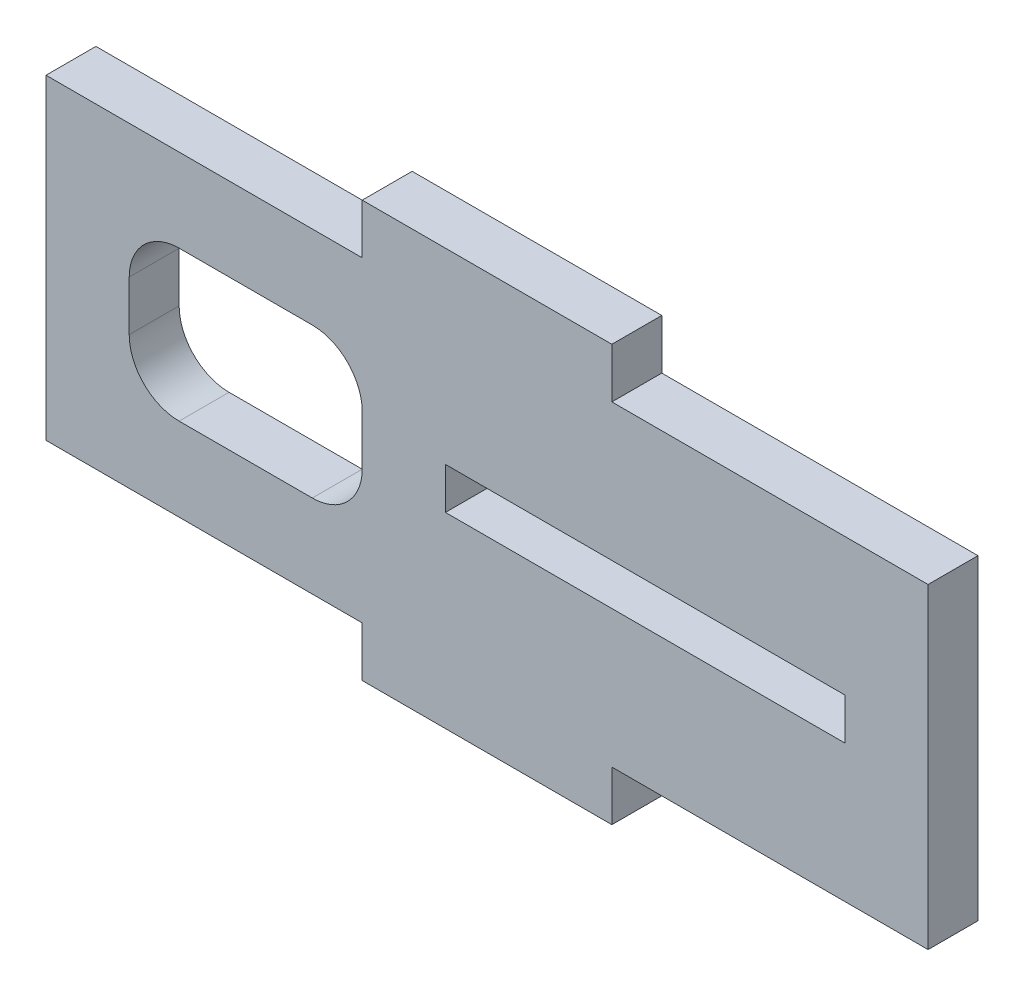
ISO-10303-21;
HEADER;
FILE_DESCRIPTION(('STEP AP214'),'2;1');
FILE_NAME('part.step','',(''),(''),'','','');
FILE_SCHEMA(('AUTOMOTIVE_DESIGN { 1 0 10303 214 1 1 1 1 }'));
ENDSEC;
DATA;
#1=APPLICATION_CONTEXT('core data for automotive mechanical design processes');
#2=APPLICATION_PROTOCOL_DEFINITION('international standard','automotive_design',2000,#1);
#3=PRODUCT_CONTEXT('',#1,'mechanical');
#4=PRODUCT('Part','Part','',(#3));
#5=PRODUCT_RELATED_PRODUCT_CATEGORY('part','',(#4));
#6=PRODUCT_DEFINITION_FORMATION('','',#4);
#7=PRODUCT_DEFINITION_CONTEXT('part definition',#1,'design');
#8=PRODUCT_DEFINITION('design','',#6,#7);
#9=PRODUCT_DEFINITION_SHAPE('','',#8);
#10=(LENGTH_UNIT() NAMED_UNIT(*) SI_UNIT(.MILLI.,.METRE.));
#11=(NAMED_UNIT(*) PLANE_ANGLE_UNIT() SI_UNIT($,.RADIAN.));
#12=(NAMED_UNIT(*) SI_UNIT($,.STERADIAN.) SOLID_ANGLE_UNIT());
#13=UNCERTAINTY_MEASURE_WITH_UNIT(LENGTH_MEASURE(1.E-05),#10,'distance_accuracy_value','');
#14=(GEOMETRIC_REPRESENTATION_CONTEXT(3) GLOBAL_UNCERTAINTY_ASSIGNED_CONTEXT((#13)) GLOBAL_UNIT_ASSIGNED_CONTEXT((#10,
#11,#12)) REPRESENTATION_CONTEXT('',''));
#15=CARTESIAN_POINT('',(0.,0.,0.));
#16=DIRECTION('',(0.,0.,1.));
#17=DIRECTION('',(1.,0.,0.));
#18=AXIS2_PLACEMENT_3D('',#15,#16,#17);
#19=CARTESIAN_POINT('',(0.,0.,2.99999999999989));
#20=DIRECTION('',(0.,0.,-1.));
#21=DIRECTION('',(-1.,0.,0.));
#22=AXIS2_PLACEMENT_3D('',#19,#20,#21);
#23=PLANE('',#22);
#24=DIRECTION('',(0.,-1.,0.));
#25=VECTOR('',#24,1.);
#26=CARTESIAN_POINT('',(-2.5,1.25,3.00000000000011));
#27=LINE('',#26,#25);
#28=CARTESIAN_POINT('',(-2.5,1.25,3.00000000000011));
#29=VERTEX_POINT('',#28);
#30=CARTESIAN_POINT('',(-2.5,-1.25,3.00000000000011));
#31=VERTEX_POINT('',#30);
#32=EDGE_CURVE('E256',#29,#31,#27,.T.);
#33=ORIENTED_EDGE('',*,*,#32,.F.);
#34=DIRECTION('',(-1.,0.,0.));
#35=VECTOR('',#34,1.);
#36=CARTESIAN_POINT('',(-2.5,1.25,3.00000000000011));
#37=LINE('',#36,#35);
#38=CARTESIAN_POINT('',(21.5000000000001,1.25,3.00000000000011));
#39=VERTEX_POINT('',#38);
#40=EDGE_CURVE('E264',#39,#29,#37,.T.);
#41=ORIENTED_EDGE('',*,*,#40,.F.);
#42=DIRECTION('',(0.,1.,0.));
#43=VECTOR('',#42,1.);
#44=CARTESIAN_POINT('',(21.5000000000001,1.25,3.00000000000011));
#45=LINE('',#44,#43);
#46=CARTESIAN_POINT('',(21.5000000000001,-1.25,3.00000000000011));
#47=VERTEX_POINT('',#46);
#48=EDGE_CURVE('E261',#47,#39,#45,.T.);
#49=ORIENTED_EDGE('',*,*,#48,.F.);
#50=DIRECTION('',(1.,0.,0.));
#51=VECTOR('',#50,1.);
#52=CARTESIAN_POINT('',(-2.5,-1.25,3.00000000000011));
#53=LINE('',#52,#51);
#54=EDGE_CURVE('E258',#31,#47,#53,.T.);
#55=ORIENTED_EDGE('',*,*,#54,.F.);
#56=EDGE_LOOP('',(#33,#41,#49,#55));
#57=FACE_BOUND('',#56,.T.);
#58=DIRECTION('',(1.,0.,0.));
#59=VECTOR('',#58,1.);
#60=CARTESIAN_POINT('',(-7.50000000000002,-9.49999999999999,2.99999999999989));
#61=LINE('',#60,#59);
#62=CARTESIAN_POINT('',(-26.5000000000001,-9.49999999999999,2.99999999999989));
#63=VERTEX_POINT('',#62);
#64=CARTESIAN_POINT('',(-7.50000000000002,-9.49999999999999,2.99999999999989));
#65=VERTEX_POINT('',#64);
#66=EDGE_CURVE('E287',#63,#65,#61,.T.);
#67=ORIENTED_EDGE('',*,*,#66,.T.);
#68=DIRECTION('',(0.,-1.,0.));
#69=VECTOR('',#68,1.);
#70=CARTESIAN_POINT('',(-7.50000000000002,-12.5,2.99999999999989));
#71=LINE('',#70,#69);
#72=CARTESIAN_POINT('',(-7.50000000000002,-12.5,2.99999999999989));
#73=VERTEX_POINT('',#72);
#74=EDGE_CURVE('E290',#65,#73,#71,.T.);
#75=ORIENTED_EDGE('',*,*,#74,.T.);
#76=DIRECTION('',(1.,0.,0.));
#77=VECTOR('',#76,1.);
#78=CARTESIAN_POINT('',(7.50000000000002,-12.5,2.99999999999989));
#79=LINE('',#78,#77);
#80=CARTESIAN_POINT('',(7.50000000000002,-12.5,2.99999999999989));
#81=VERTEX_POINT('',#80);
#82=EDGE_CURVE('E293',#73,#81,#79,.T.);
#83=ORIENTED_EDGE('',*,*,#82,.T.);
#84=DIRECTION('',(0.,1.,0.));
#85=VECTOR('',#84,1.);
#86=CARTESIAN_POINT('',(7.50000000000002,-9.49999999999999,2.99999999999989));
#87=LINE('',#86,#85);
#88=CARTESIAN_POINT('',(7.50000000000002,-9.49999999999999,2.99999999999989));
#89=VERTEX_POINT('',#88);
#90=EDGE_CURVE('E295',#81,#89,#87,.T.);
#91=ORIENTED_EDGE('',*,*,#90,.T.);
#92=DIRECTION('',(1.,0.,0.));
#93=VECTOR('',#92,1.);
#94=CARTESIAN_POINT('',(26.5000000000001,-9.49999999999998,3.00000000000011));
#95=LINE('',#94,#93);
#96=CARTESIAN_POINT('',(26.5000000000001,-9.49999999999998,3.00000000000011));
#97=VERTEX_POINT('',#96);
#98=EDGE_CURVE('E297',#89,#97,#95,.T.);
#99=ORIENTED_EDGE('',*,*,#98,.T.);
#100=DIRECTION('',(0.,1.,0.));
#101=VECTOR('',#100,1.);
#102=CARTESIAN_POINT('',(26.5000000000001,9.50000000000002,3.00000000000011));
#103=LINE('',#102,#101);
#104=CARTESIAN_POINT('',(26.5000000000001,9.50000000000002,3.00000000000011));
#105=VERTEX_POINT('',#104);
#106=EDGE_CURVE('E299',#97,#105,#103,.T.);
#107=ORIENTED_EDGE('',*,*,#106,.T.);
#108=DIRECTION('',(-1.,0.,0.));
#109=VECTOR('',#108,1.);
#110=CARTESIAN_POINT('',(7.50000000000002,9.50000000000001,2.99999999999989));
#111=LINE('',#110,#109);
#112=CARTESIAN_POINT('',(7.50000000000002,9.50000000000001,2.99999999999989));
#113=VERTEX_POINT('',#112);
#114=EDGE_CURVE('E301',#105,#113,#111,.T.);
#115=ORIENTED_EDGE('',*,*,#114,.T.);
#116=DIRECTION('',(0.,1.,0.));
#117=VECTOR('',#116,1.);
#118=CARTESIAN_POINT('',(7.50000000000002,12.5,2.99999999999989));
#119=LINE('',#118,#117);
#120=CARTESIAN_POINT('',(7.50000000000002,12.5,2.99999999999989));
#121=VERTEX_POINT('',#120);
#122=EDGE_CURVE('E303',#113,#121,#119,.T.);
#123=ORIENTED_EDGE('',*,*,#122,.T.);
#124=DIRECTION('',(-1.,0.,0.));
#125=VECTOR('',#124,1.);
#126=CARTESIAN_POINT('',(-7.50000000000002,12.5,2.99999999999989));
#127=LINE('',#126,#125);
#128=CARTESIAN_POINT('',(-7.50000000000002,12.5,2.99999999999989));
#129=VERTEX_POINT('',#128);
#130=EDGE_CURVE('E305',#121,#129,#127,.T.);
#131=ORIENTED_EDGE('',*,*,#130,.T.);
#132=DIRECTION('',(0.,-1.,0.));
#133=VECTOR('',#132,1.);
#134=CARTESIAN_POINT('',(-7.50000000000002,9.50000000000001,2.99999999999989));
#135=LINE('',#134,#133);
#136=CARTESIAN_POINT('',(-7.50000000000002,9.50000000000001,2.99999999999989));
#137=VERTEX_POINT('',#136);
#138=EDGE_CURVE('E307',#129,#137,#135,.T.);
#139=ORIENTED_EDGE('',*,*,#138,.T.);
#140=DIRECTION('',(-1.,0.,0.));
#141=VECTOR('',#140,1.);
#142=CARTESIAN_POINT('',(-26.5000000000001,9.50000000000001,2.99999999999989));
#143=LINE('',#142,#141);
#144=CARTESIAN_POINT('',(-26.5000000000001,9.50000000000001,2.99999999999989));
#145=VERTEX_POINT('',#144);
#146=EDGE_CURVE('E309',#137,#145,#143,.T.);
#147=ORIENTED_EDGE('',*,*,#146,.T.);
#148=DIRECTION('',(0.,-1.,0.));
#149=VECTOR('',#148,1.);
#150=CARTESIAN_POINT('',(-26.5000000000001,-9.49999999999999,2.99999999999989));
#151=LINE('',#150,#149);
#152=EDGE_CURVE('E311',#145,#63,#151,.T.);
#153=ORIENTED_EDGE('',*,*,#152,.T.);
#154=EDGE_LOOP('',(#67,#75,#83,#91,#99,#107,#115,#123,#131,#139,#147,#153));
#155=FACE_BOUND('',#154,.T.);
#156=CARTESIAN_POINT('',(-10.5,1.5,2.99999999999989));
#157=DIRECTION('',(0.,0.,1.));
#158=DIRECTION('',(-1.,0.,0.));
#159=AXIS2_PLACEMENT_3D('',#156,#157,#158);
#160=CIRCLE('',#159,3.);
#161=CARTESIAN_POINT('',(-7.50000000000002,1.5,2.99999999999989));
#162=VERTEX_POINT('',#161);
#163=CARTESIAN_POINT('',(-10.5,4.5,2.99999999999989));
#164=VERTEX_POINT('',#163);
#165=EDGE_CURVE('E191',#162,#164,#160,.T.);
#166=ORIENTED_EDGE('',*,*,#165,.F.);
#167=DIRECTION('',(0.,1.,0.));
#168=VECTOR('',#167,1.);
#169=CARTESIAN_POINT('',(-7.50000000000002,1.5,2.99999999999989));
#170=LINE('',#169,#168);
#171=CARTESIAN_POINT('',(-7.50000000000002,-1.5,2.99999999999989));
#172=VERTEX_POINT('',#171);
#173=EDGE_CURVE('E224',#172,#162,#170,.T.);
#174=ORIENTED_EDGE('',*,*,#173,.F.);
#175=CARTESIAN_POINT('',(-10.5,-1.5,2.99999999999989));
#176=DIRECTION('',(0.,0.,1.));
#177=DIRECTION('',(-1.,0.,0.));
#178=AXIS2_PLACEMENT_3D('',#175,#176,#177);
#179=CIRCLE('',#178,3.);
#180=CARTESIAN_POINT('',(-10.5,-4.5,2.99999999999989));
#181=VERTEX_POINT('',#180);
#182=EDGE_CURVE('E222',#181,#172,#179,.T.);
#183=ORIENTED_EDGE('',*,*,#182,.F.);
#184=DIRECTION('',(1.,0.,0.));
#185=VECTOR('',#184,1.);
#186=CARTESIAN_POINT('',(-18.5,-4.49999999999998,2.99999999999989));
#187=LINE('',#186,#185);
#188=CARTESIAN_POINT('',(-18.5,-4.49999999999998,2.99999999999989));
#189=VERTEX_POINT('',#188);
#190=EDGE_CURVE('E220',#189,#181,#187,.T.);
#191=ORIENTED_EDGE('',*,*,#190,.F.);
#192=CARTESIAN_POINT('',(-18.5,-1.49999999999998,2.99999999999989));
#193=DIRECTION('',(0.,0.,1.));
#194=DIRECTION('',(-1.,0.,0.));
#195=AXIS2_PLACEMENT_3D('',#192,#193,#194);
#196=CIRCLE('',#195,3.);
#197=CARTESIAN_POINT('',(-21.5,-1.49999999999998,3.00000000000011));
#198=VERTEX_POINT('',#197);
#199=EDGE_CURVE('E218',#198,#189,#196,.T.);
#200=ORIENTED_EDGE('',*,*,#199,.F.);
#201=DIRECTION('',(0.,-1.,0.));
#202=VECTOR('',#201,1.);
#203=CARTESIAN_POINT('',(-21.5,1.5,3.00000000000011));
#204=LINE('',#203,#202);
#205=CARTESIAN_POINT('',(-21.5,1.5,3.00000000000011));
#206=VERTEX_POINT('',#205);
#207=EDGE_CURVE('E214',#206,#198,#204,.T.);
#208=ORIENTED_EDGE('',*,*,#207,.F.);
#209=CARTESIAN_POINT('',(-18.5,1.5,2.99999999999989));
#210=DIRECTION('',(0.,0.,1.));
#211=DIRECTION('',(-1.,0.,0.));
#212=AXIS2_PLACEMENT_3D('',#209,#210,#211);
#213=CIRCLE('',#212,3.);
#214=CARTESIAN_POINT('',(-18.5,4.5,2.99999999999989));
#215=VERTEX_POINT('',#214);
#216=EDGE_CURVE('E212',#215,#206,#213,.T.);
#217=ORIENTED_EDGE('',*,*,#216,.F.);
#218=DIRECTION('',(-1.,0.,0.));
#219=VECTOR('',#218,1.);
#220=CARTESIAN_POINT('',(-18.5,4.5,2.99999999999989));
#221=LINE('',#220,#219);
#222=EDGE_CURVE('E199',#164,#215,#221,.T.);
#223=ORIENTED_EDGE('',*,*,#222,.F.);
#224=EDGE_LOOP('',(#166,#174,#183,#191,#200,#208,#217,#223));
#225=FACE_BOUND('',#224,.T.);
#226=ADVANCED_FACE('F30',(#57,#155,#225),#23,.F.);
#227=CARTESIAN_POINT('',(0.,0.,0.));
#228=DIRECTION('',(0.,0.,-1.));
#229=DIRECTION('',(-1.,0.,0.));
#230=AXIS2_PLACEMENT_3D('',#227,#228,#229);
#231=PLANE('',#230);
#232=DIRECTION('',(1.,0.,0.));
#233=VECTOR('',#232,1.);
#234=CARTESIAN_POINT('',(-7.50000000000004,-9.49999999999999,0.));
#235=LINE('',#234,#233);
#236=CARTESIAN_POINT('',(-26.5,-9.49999999999999,0.));
#237=VERTEX_POINT('',#236);
#238=CARTESIAN_POINT('',(-7.50000000000004,-9.49999999999999,0.));
#239=VERTEX_POINT('',#238);
#240=EDGE_CURVE('E286',#237,#239,#235,.T.);
#241=ORIENTED_EDGE('',*,*,#240,.F.);
#242=DIRECTION('',(0.,-1.,0.));
#243=VECTOR('',#242,1.);
#244=CARTESIAN_POINT('',(-26.5,-9.49999999999999,0.));
#245=LINE('',#244,#243);
#246=CARTESIAN_POINT('',(-26.5,9.50000000000001,0.));
#247=VERTEX_POINT('',#246);
#248=EDGE_CURVE('E291',#247,#237,#245,.T.);
#249=ORIENTED_EDGE('',*,*,#248,.F.);
#250=DIRECTION('',(-1.,0.,0.));
#251=VECTOR('',#250,1.);
#252=CARTESIAN_POINT('',(-26.5,9.50000000000001,0.));
#253=LINE('',#252,#251);
#254=CARTESIAN_POINT('',(-7.50000000000004,9.50000000000001,0.));
#255=VERTEX_POINT('',#254);
#256=EDGE_CURVE('E334',#255,#247,#253,.T.);
#257=ORIENTED_EDGE('',*,*,#256,.F.);
#258=DIRECTION('',(0.,-1.,0.));
#259=VECTOR('',#258,1.);
#260=CARTESIAN_POINT('',(-7.50000000000004,9.50000000000001,0.));
#261=LINE('',#260,#259);
#262=CARTESIAN_POINT('',(-7.50000000000004,12.5,0.));
#263=VERTEX_POINT('',#262);
#264=EDGE_CURVE('E332',#263,#255,#261,.T.);
#265=ORIENTED_EDGE('',*,*,#264,.F.);
#266=DIRECTION('',(-1.,0.,0.));
#267=VECTOR('',#266,1.);
#268=CARTESIAN_POINT('',(-7.50000000000004,12.5,0.));
#269=LINE('',#268,#267);
#270=CARTESIAN_POINT('',(7.50000000000002,12.5,-2.22044604925031E-13));
#271=VERTEX_POINT('',#270);
#272=EDGE_CURVE('E330',#271,#263,#269,.T.);
#273=ORIENTED_EDGE('',*,*,#272,.F.);
#274=DIRECTION('',(0.,1.,0.));
#275=VECTOR('',#274,1.);
#276=CARTESIAN_POINT('',(7.50000000000002,12.5,-2.22044604925031E-13));
#277=LINE('',#276,#275);
#278=CARTESIAN_POINT('',(7.50000000000002,9.50000000000001,-2.22044604925031E-13));
#279=VERTEX_POINT('',#278);
#280=EDGE_CURVE('E328',#279,#271,#277,.T.);
#281=ORIENTED_EDGE('',*,*,#280,.F.);
#282=DIRECTION('',(-1.,0.,0.));
#283=VECTOR('',#282,1.);
#284=CARTESIAN_POINT('',(7.50000000000002,9.50000000000001,-2.22044604925031E-13));
#285=LINE('',#284,#283);
#286=CARTESIAN_POINT('',(26.5000000000001,9.50000000000002,0.));
#287=VERTEX_POINT('',#286);
#288=EDGE_CURVE('E326',#287,#279,#285,.T.);
#289=ORIENTED_EDGE('',*,*,#288,.F.);
#290=DIRECTION('',(0.,1.,0.));
#291=VECTOR('',#290,1.);
#292=CARTESIAN_POINT('',(26.5000000000001,9.50000000000002,0.));
#293=LINE('',#292,#291);
#294=CARTESIAN_POINT('',(26.5000000000001,-9.49999999999998,0.));
#295=VERTEX_POINT('',#294);
#296=EDGE_CURVE('E324',#295,#287,#293,.T.);
#297=ORIENTED_EDGE('',*,*,#296,.F.);
#298=DIRECTION('',(1.,0.,0.));
#299=VECTOR('',#298,1.);
#300=CARTESIAN_POINT('',(26.5000000000001,-9.49999999999998,0.));
#301=LINE('',#300,#299);
#302=CARTESIAN_POINT('',(7.50000000000002,-9.49999999999999,-2.22044604925031E-13));
#303=VERTEX_POINT('',#302);
#304=EDGE_CURVE('E322',#303,#295,#301,.T.);
#305=ORIENTED_EDGE('',*,*,#304,.F.);
#306=DIRECTION('',(0.,1.,0.));
#307=VECTOR('',#306,1.);
#308=CARTESIAN_POINT('',(7.50000000000002,-9.49999999999999,-2.22044604925031E-13));
#309=LINE('',#308,#307);
#310=CARTESIAN_POINT('',(7.50000000000002,-12.5,-2.22044604925031E-13));
#311=VERTEX_POINT('',#310);
#312=EDGE_CURVE('E320',#311,#303,#309,.T.);
#313=ORIENTED_EDGE('',*,*,#312,.F.);
#314=DIRECTION('',(1.,0.,0.));
#315=VECTOR('',#314,1.);
#316=CARTESIAN_POINT('',(7.50000000000002,-12.5,-2.22044604925031E-13));
#317=LINE('',#316,#315);
#318=CARTESIAN_POINT('',(-7.50000000000004,-12.5,0.));
#319=VERTEX_POINT('',#318);
#320=EDGE_CURVE('E318',#319,#311,#317,.T.);
#321=ORIENTED_EDGE('',*,*,#320,.F.);
#322=DIRECTION('',(0.,-1.,0.));
#323=VECTOR('',#322,1.);
#324=CARTESIAN_POINT('',(-7.50000000000004,-12.5,0.));
#325=LINE('',#324,#323);
#326=EDGE_CURVE('E316',#239,#319,#325,.T.);
#327=ORIENTED_EDGE('',*,*,#326,.F.);
#328=EDGE_LOOP('',(#241,#249,#257,#265,#273,#281,#289,#297,#305,#313,#321,#327));
#329=FACE_BOUND('',#328,.T.);
#330=DIRECTION('',(-1.,0.,0.));
#331=VECTOR('',#330,1.);
#332=CARTESIAN_POINT('',(-2.5,1.25,2.22044604925031E-13));
#333=LINE('',#332,#331);
#334=CARTESIAN_POINT('',(21.5,1.25,2.22044604925031E-13));
#335=VERTEX_POINT('',#334);
#336=CARTESIAN_POINT('',(-2.5,1.25,2.22044604925031E-13));
#337=VERTEX_POINT('',#336);
#338=EDGE_CURVE('E259',#335,#337,#333,.T.);
#339=ORIENTED_EDGE('',*,*,#338,.T.);
#340=DIRECTION('',(0.,-1.,0.));
#341=VECTOR('',#340,1.);
#342=CARTESIAN_POINT('',(-2.5,1.25,2.22044604925031E-13));
#343=LINE('',#342,#341);
#344=CARTESIAN_POINT('',(-2.5,-1.25,2.22044604925031E-13));
#345=VERTEX_POINT('',#344);
#346=EDGE_CURVE('E207',#337,#345,#343,.T.);
#347=ORIENTED_EDGE('',*,*,#346,.T.);
#348=DIRECTION('',(1.,0.,0.));
#349=VECTOR('',#348,1.);
#350=CARTESIAN_POINT('',(-2.5,-1.25,2.22044604925031E-13));
#351=LINE('',#350,#349);
#352=CARTESIAN_POINT('',(21.5,-1.25,2.22044604925031E-13));
#353=VERTEX_POINT('',#352);
#354=EDGE_CURVE('E269',#345,#353,#351,.T.);
#355=ORIENTED_EDGE('',*,*,#354,.T.);
#356=DIRECTION('',(0.,1.,0.));
#357=VECTOR('',#356,1.);
#358=CARTESIAN_POINT('',(21.5,1.25,2.22044604925031E-13));
#359=LINE('',#358,#357);
#360=EDGE_CURVE('E272',#353,#335,#359,.T.);
#361=ORIENTED_EDGE('',*,*,#360,.T.);
#362=EDGE_LOOP('',(#339,#347,#355,#361));
#363=FACE_BOUND('',#362,.T.);
#364=DIRECTION('',(0.,1.,0.));
#365=VECTOR('',#364,1.);
#366=CARTESIAN_POINT('',(-7.50000000000004,1.5,0.));
#367=LINE('',#366,#365);
#368=CARTESIAN_POINT('',(-7.50000000000004,-1.5,0.));
#369=VERTEX_POINT('',#368);
#370=CARTESIAN_POINT('',(-7.50000000000004,1.5,0.));
#371=VERTEX_POINT('',#370);
#372=EDGE_CURVE('E200',#369,#371,#367,.T.);
#373=ORIENTED_EDGE('',*,*,#372,.T.);
#374=CARTESIAN_POINT('',(-10.5,1.5,0.));
#375=DIRECTION('',(0.,0.,1.));
#376=DIRECTION('',(-1.,0.,0.));
#377=AXIS2_PLACEMENT_3D('',#374,#375,#376);
#378=CIRCLE('',#377,3.);
#379=CARTESIAN_POINT('',(-10.5,4.5,0.));
#380=VERTEX_POINT('',#379);
#381=EDGE_CURVE('E53',#371,#380,#378,.T.);
#382=ORIENTED_EDGE('',*,*,#381,.T.);
#383=DIRECTION('',(-1.,0.,0.));
#384=VECTOR('',#383,1.);
#385=CARTESIAN_POINT('',(-18.5,4.5,-2.22044604925031E-13));
#386=LINE('',#385,#384);
#387=CARTESIAN_POINT('',(-18.5,4.5,-2.22044604925031E-13));
#388=VERTEX_POINT('',#387);
#389=EDGE_CURVE('E206',#380,#388,#386,.T.);
#390=ORIENTED_EDGE('',*,*,#389,.T.);
#391=CARTESIAN_POINT('',(-18.5,1.5,-2.22044604925031E-13));
#392=DIRECTION('',(0.,0.,1.));
#393=DIRECTION('',(-1.,0.,0.));
#394=AXIS2_PLACEMENT_3D('',#391,#392,#393);
#395=CIRCLE('',#394,3.);
#396=CARTESIAN_POINT('',(-21.5,1.5,0.));
#397=VERTEX_POINT('',#396);
#398=EDGE_CURVE('E228',#388,#397,#395,.T.);
#399=ORIENTED_EDGE('',*,*,#398,.T.);
#400=DIRECTION('',(0.,-1.,0.));
#401=VECTOR('',#400,1.);
#402=CARTESIAN_POINT('',(-21.5,1.5,0.));
#403=LINE('',#402,#401);
#404=CARTESIAN_POINT('',(-21.5,-1.49999999999998,0.));
#405=VERTEX_POINT('',#404);
#406=EDGE_CURVE('E231',#397,#405,#403,.T.);
#407=ORIENTED_EDGE('',*,*,#406,.T.);
#408=CARTESIAN_POINT('',(-18.5,-1.49999999999998,-2.22044604925031E-13));
#409=DIRECTION('',(0.,0.,1.));
#410=DIRECTION('',(-1.,0.,0.));
#411=AXIS2_PLACEMENT_3D('',#408,#409,#410);
#412=CIRCLE('',#411,3.);
#413=CARTESIAN_POINT('',(-18.5,-4.49999999999998,-2.22044604925031E-13));
#414=VERTEX_POINT('',#413);
#415=EDGE_CURVE('E234',#405,#414,#412,.T.);
#416=ORIENTED_EDGE('',*,*,#415,.T.);
#417=DIRECTION('',(1.,0.,0.));
#418=VECTOR('',#417,1.);
#419=CARTESIAN_POINT('',(-18.5,-4.49999999999998,-2.22044604925031E-13));
#420=LINE('',#419,#418);
#421=CARTESIAN_POINT('',(-10.5,-4.5,0.));
#422=VERTEX_POINT('',#421);
#423=EDGE_CURVE('E237',#414,#422,#420,.T.);
#424=ORIENTED_EDGE('',*,*,#423,.T.);
#425=CARTESIAN_POINT('',(-10.5,-1.5,0.));
#426=DIRECTION('',(0.,0.,1.));
#427=DIRECTION('',(-1.,0.,0.));
#428=AXIS2_PLACEMENT_3D('',#425,#426,#427);
#429=CIRCLE('',#428,3.);
#430=EDGE_CURVE('E240',#422,#369,#429,.T.);
#431=ORIENTED_EDGE('',*,*,#430,.T.);
#432=EDGE_LOOP('',(#373,#382,#390,#399,#407,#416,#424,#431));
#433=FACE_BOUND('',#432,.T.);
#434=ADVANCED_FACE('F376',(#329,#363,#433),#231,.T.);
#435=CARTESIAN_POINT('',(-7.50000000000002,-9.49999999999999,2.99999999999989));
#436=DIRECTION('',(0.,1.,0.));
#437=DIRECTION('',(-1.,0.,0.));
#438=AXIS2_PLACEMENT_3D('',#435,#436,#437);
#439=PLANE('',#438);
#440=ORIENTED_EDGE('',*,*,#240,.T.);
#441=DIRECTION('',(0.,0.,-1.));
#442=VECTOR('',#441,1.);
#443=CARTESIAN_POINT('',(-7.50000000000002,-9.49999999999999,2.99999999999989));
#444=LINE('',#443,#442);
#445=EDGE_CURVE('E11',#65,#239,#444,.T.);
#446=ORIENTED_EDGE('',*,*,#445,.F.);
#447=ORIENTED_EDGE('',*,*,#66,.F.);
#448=DIRECTION('',(0.,0.,-1.));
#449=VECTOR('',#448,1.);
#450=CARTESIAN_POINT('',(-26.5000000000001,-9.49999999999999,2.99999999999989));
#451=LINE('',#450,#449);
#452=EDGE_CURVE('E313',#63,#237,#451,.T.);
#453=ORIENTED_EDGE('',*,*,#452,.T.);
#454=EDGE_LOOP('',(#440,#446,#447,#453));
#455=FACE_BOUND('',#454,.T.);
#456=ADVANCED_FACE('F32',(#455),#439,.F.);
#457=CARTESIAN_POINT('',(-7.50000000000002,-12.5,2.99999999999989));
#458=DIRECTION('',(1.,0.,0.));
#459=DIRECTION('',(0.,0.,-1.));
#460=AXIS2_PLACEMENT_3D('',#457,#458,#459);
#461=PLANE('',#460);
#462=ORIENTED_EDGE('',*,*,#326,.T.);
#463=DIRECTION('',(0.,0.,-1.));
#464=VECTOR('',#463,1.);
#465=CARTESIAN_POINT('',(-7.50000000000002,-12.5,2.99999999999989));
#466=LINE('',#465,#464);
#467=EDGE_CURVE('E38',#73,#319,#466,.T.);
#468=ORIENTED_EDGE('',*,*,#467,.F.);
#469=ORIENTED_EDGE('',*,*,#74,.F.);
#470=ORIENTED_EDGE('',*,*,#445,.T.);
#471=EDGE_LOOP('',(#462,#468,#469,#470));
#472=FACE_BOUND('',#471,.T.);
#473=ADVANCED_FACE('F393',(#472),#461,.F.);
#474=CARTESIAN_POINT('',(7.50000000000002,-12.5,2.99999999999989));
#475=DIRECTION('',(0.,1.,0.));
#476=DIRECTION('',(-1.,0.,0.));
#477=AXIS2_PLACEMENT_3D('',#474,#475,#476);
#478=PLANE('',#477);
#479=ORIENTED_EDGE('',*,*,#320,.T.);
#480=DIRECTION('',(0.,0.,-1.));
#481=VECTOR('',#480,1.);
#482=CARTESIAN_POINT('',(7.50000000000002,-12.5,2.99999999999989));
#483=LINE('',#482,#481);
#484=EDGE_CURVE('E363',#81,#311,#483,.T.);
#485=ORIENTED_EDGE('',*,*,#484,.F.);
#486=ORIENTED_EDGE('',*,*,#82,.F.);
#487=ORIENTED_EDGE('',*,*,#467,.T.);
#488=EDGE_LOOP('',(#479,#485,#486,#487));
#489=FACE_BOUND('',#488,.T.);
#490=ADVANCED_FACE('F370',(#489),#478,.F.);
#491=CARTESIAN_POINT('',(7.50000000000002,-9.49999999999999,2.99999999999989));
#492=DIRECTION('',(-1.,0.,0.));
#493=DIRECTION('',(0.,-1.,0.));
#494=AXIS2_PLACEMENT_3D('',#491,#492,#493);
#495=PLANE('',#494);
#496=ORIENTED_EDGE('',*,*,#312,.T.);
#497=DIRECTION('',(0.,0.,-1.));
#498=VECTOR('',#497,1.);
#499=CARTESIAN_POINT('',(7.50000000000002,-9.49999999999999,2.99999999999989));
#500=LINE('',#499,#498);
#501=EDGE_CURVE('E360',#89,#303,#500,.T.);
#502=ORIENTED_EDGE('',*,*,#501,.F.);
#503=ORIENTED_EDGE('',*,*,#90,.F.);
#504=ORIENTED_EDGE('',*,*,#484,.T.);
#505=EDGE_LOOP('',(#496,#502,#503,#504));
#506=FACE_BOUND('',#505,.T.);
#507=ADVANCED_FACE('F382',(#506),#495,.F.);
#508=CARTESIAN_POINT('',(26.5000000000001,-9.49999999999998,3.00000000000011));
#509=DIRECTION('',(0.,1.,0.));
#510=DIRECTION('',(-1.,0.,0.));
#511=AXIS2_PLACEMENT_3D('',#508,#509,#510);
#512=PLANE('',#511);
#513=ORIENTED_EDGE('',*,*,#304,.T.);
#514=DIRECTION('',(0.,0.,-1.));
#515=VECTOR('',#514,1.);
#516=CARTESIAN_POINT('',(26.5000000000001,-9.49999999999998,3.00000000000011));
#517=LINE('',#516,#515);
#518=EDGE_CURVE('E357',#97,#295,#517,.T.);
#519=ORIENTED_EDGE('',*,*,#518,.F.);
#520=ORIENTED_EDGE('',*,*,#98,.F.);
#521=ORIENTED_EDGE('',*,*,#501,.T.);
#522=EDGE_LOOP('',(#513,#519,#520,#521));
#523=FACE_BOUND('',#522,.T.);
#524=ADVANCED_FACE('F386',(#523),#512,.F.);
#525=CARTESIAN_POINT('',(26.5000000000001,9.50000000000002,3.00000000000011));
#526=DIRECTION('',(-1.,0.,0.));
#527=DIRECTION('',(0.,-1.,0.));
#528=AXIS2_PLACEMENT_3D('',#525,#526,#527);
#529=PLANE('',#528);
#530=ORIENTED_EDGE('',*,*,#296,.T.);
#531=DIRECTION('',(0.,0.,-1.));
#532=VECTOR('',#531,1.);
#533=CARTESIAN_POINT('',(26.5000000000001,9.50000000000002,3.00000000000011));
#534=LINE('',#533,#532);
#535=EDGE_CURVE('E354',#105,#287,#534,.T.);
#536=ORIENTED_EDGE('',*,*,#535,.F.);
#537=ORIENTED_EDGE('',*,*,#106,.F.);
#538=ORIENTED_EDGE('',*,*,#518,.T.);
#539=EDGE_LOOP('',(#530,#536,#537,#538));
#540=FACE_BOUND('',#539,.T.);
#541=ADVANCED_FACE('F426',(#540),#529,.F.);
#542=CARTESIAN_POINT('',(7.50000000000002,9.50000000000001,2.99999999999989));
#543=DIRECTION('',(0.,-1.,0.));
#544=DIRECTION('',(1.,0.,0.));
#545=AXIS2_PLACEMENT_3D('',#542,#543,#544);
#546=PLANE('',#545);
#547=ORIENTED_EDGE('',*,*,#288,.T.);
#548=DIRECTION('',(0.,0.,-1.));
#549=VECTOR('',#548,1.);
#550=CARTESIAN_POINT('',(7.50000000000002,9.50000000000001,2.99999999999989));
#551=LINE('',#550,#549);
#552=EDGE_CURVE('E351',#113,#279,#551,.T.);
#553=ORIENTED_EDGE('',*,*,#552,.F.);
#554=ORIENTED_EDGE('',*,*,#114,.F.);
#555=ORIENTED_EDGE('',*,*,#535,.T.);
#556=EDGE_LOOP('',(#547,#553,#554,#555));
#557=FACE_BOUND('',#556,.T.);
#558=ADVANCED_FACE('F424',(#557),#546,.F.);
#559=CARTESIAN_POINT('',(7.50000000000002,12.5,2.99999999999989));
#560=DIRECTION('',(-1.,0.,0.));
#561=DIRECTION('',(0.,0.,1.));
#562=AXIS2_PLACEMENT_3D('',#559,#560,#561);
#563=PLANE('',#562);
#564=ORIENTED_EDGE('',*,*,#280,.T.);
#565=DIRECTION('',(0.,0.,-1.));
#566=VECTOR('',#565,1.);
#567=CARTESIAN_POINT('',(7.50000000000002,12.5,2.99999999999989));
#568=LINE('',#567,#566);
#569=EDGE_CURVE('E348',#121,#271,#568,.T.);
#570=ORIENTED_EDGE('',*,*,#569,.F.);
#571=ORIENTED_EDGE('',*,*,#122,.F.);
#572=ORIENTED_EDGE('',*,*,#552,.T.);
#573=EDGE_LOOP('',(#564,#570,#571,#572));
#574=FACE_BOUND('',#573,.T.);
#575=ADVANCED_FACE('F420',(#574),#563,.F.);
#576=CARTESIAN_POINT('',(-7.50000000000002,12.5,2.99999999999989));
#577=DIRECTION('',(0.,-1.,0.));
#578=DIRECTION('',(1.,0.,0.));
#579=AXIS2_PLACEMENT_3D('',#576,#577,#578);
#580=PLANE('',#579);
#581=ORIENTED_EDGE('',*,*,#272,.T.);
#582=DIRECTION('',(0.,0.,-1.));
#583=VECTOR('',#582,1.);
#584=CARTESIAN_POINT('',(-7.50000000000002,12.5,2.99999999999989));
#585=LINE('',#584,#583);
#586=EDGE_CURVE('E345',#129,#263,#585,.T.);
#587=ORIENTED_EDGE('',*,*,#586,.F.);
#588=ORIENTED_EDGE('',*,*,#130,.F.);
#589=ORIENTED_EDGE('',*,*,#569,.T.);
#590=EDGE_LOOP('',(#581,#587,#588,#589));
#591=FACE_BOUND('',#590,.T.);
#592=ADVANCED_FACE('F415',(#591),#580,.F.);
#593=CARTESIAN_POINT('',(-7.50000000000002,9.50000000000001,2.99999999999989));
#594=DIRECTION('',(1.,0.,0.));
#595=DIRECTION('',(0.,0.,-1.));
#596=AXIS2_PLACEMENT_3D('',#593,#594,#595);
#597=PLANE('',#596);
#598=ORIENTED_EDGE('',*,*,#264,.T.);
#599=DIRECTION('',(0.,0.,-1.));
#600=VECTOR('',#599,1.);
#601=CARTESIAN_POINT('',(-7.50000000000002,9.50000000000001,2.99999999999989));
#602=LINE('',#601,#600);
#603=EDGE_CURVE('E342',#137,#255,#602,.T.);
#604=ORIENTED_EDGE('',*,*,#603,.F.);
#605=ORIENTED_EDGE('',*,*,#138,.F.);
#606=ORIENTED_EDGE('',*,*,#586,.T.);
#607=EDGE_LOOP('',(#598,#604,#605,#606));
#608=FACE_BOUND('',#607,.T.);
#609=ADVANCED_FACE('F409',(#608),#597,.F.);
#610=CARTESIAN_POINT('',(-26.5000000000001,9.50000000000001,2.99999999999989));
#611=DIRECTION('',(0.,-1.,0.));
#612=DIRECTION('',(0.,0.,-1.));
#613=AXIS2_PLACEMENT_3D('',#610,#611,#612);
#614=PLANE('',#613);
#615=ORIENTED_EDGE('',*,*,#256,.T.);
#616=DIRECTION('',(0.,0.,-1.));
#617=VECTOR('',#616,1.);
#618=CARTESIAN_POINT('',(-26.5000000000001,9.50000000000001,2.99999999999989));
#619=LINE('',#618,#617);
#620=EDGE_CURVE('E339',#145,#247,#619,.T.);
#621=ORIENTED_EDGE('',*,*,#620,.F.);
#622=ORIENTED_EDGE('',*,*,#146,.F.);
#623=ORIENTED_EDGE('',*,*,#603,.T.);
#624=EDGE_LOOP('',(#615,#621,#622,#623));
#625=FACE_BOUND('',#624,.T.);
#626=ADVANCED_FACE('F405',(#625),#614,.F.);
#627=CARTESIAN_POINT('',(-26.5000000000001,-9.49999999999999,2.99999999999989));
#628=DIRECTION('',(1.,0.,0.));
#629=DIRECTION('',(0.,0.,-1.));
#630=AXIS2_PLACEMENT_3D('',#627,#628,#629);
#631=PLANE('',#630);
#632=ORIENTED_EDGE('',*,*,#248,.T.);
#633=ORIENTED_EDGE('',*,*,#452,.F.);
#634=ORIENTED_EDGE('',*,*,#152,.F.);
#635=ORIENTED_EDGE('',*,*,#620,.T.);
#636=EDGE_LOOP('',(#632,#633,#634,#635));
#637=FACE_BOUND('',#636,.T.);
#638=ADVANCED_FACE('F400',(#637),#631,.F.);
#639=CARTESIAN_POINT('',(-2.5,1.25,3.00000000000011));
#640=DIRECTION('',(1.,0.,0.));
#641=DIRECTION('',(0.,1.,0.));
#642=AXIS2_PLACEMENT_3D('',#639,#640,#641);
#643=PLANE('',#642);
#644=ORIENTED_EDGE('',*,*,#346,.F.);
#645=DIRECTION('',(0.,0.,-1.));
#646=VECTOR('',#645,1.);
#647=CARTESIAN_POINT('',(-2.5,1.25,3.00000000000011));
#648=LINE('',#647,#646);
#649=EDGE_CURVE('E266',#29,#337,#648,.T.);
#650=ORIENTED_EDGE('',*,*,#649,.F.);
#651=ORIENTED_EDGE('',*,*,#32,.T.);
#652=DIRECTION('',(0.,0.,-1.));
#653=VECTOR('',#652,1.);
#654=CARTESIAN_POINT('',(-2.5,-1.25,3.00000000000011));
#655=LINE('',#654,#653);
#656=EDGE_CURVE('E283',#31,#345,#655,.T.);
#657=ORIENTED_EDGE('',*,*,#656,.T.);
#658=EDGE_LOOP('',(#644,#650,#651,#657));
#659=FACE_BOUND('',#658,.T.);
#660=ADVANCED_FACE('F444',(#659),#643,.T.);
#661=CARTESIAN_POINT('',(-2.5,-1.25,3.00000000000011));
#662=DIRECTION('',(0.,1.,0.));
#663=DIRECTION('',(0.,0.,1.));
#664=AXIS2_PLACEMENT_3D('',#661,#662,#663);
#665=PLANE('',#664);
#666=ORIENTED_EDGE('',*,*,#354,.F.);
#667=ORIENTED_EDGE('',*,*,#656,.F.);
#668=ORIENTED_EDGE('',*,*,#54,.T.);
#669=DIRECTION('',(0.,0.,-1.));
#670=VECTOR('',#669,1.);
#671=CARTESIAN_POINT('',(21.5000000000001,-1.25,3.00000000000011));
#672=LINE('',#671,#670);
#673=EDGE_CURVE('E281',#47,#353,#672,.T.);
#674=ORIENTED_EDGE('',*,*,#673,.T.);
#675=EDGE_LOOP('',(#666,#667,#668,#674));
#676=FACE_BOUND('',#675,.T.);
#677=ADVANCED_FACE('F482',(#676),#665,.T.);
#678=CARTESIAN_POINT('',(21.5000000000001,1.25,3.00000000000011));
#679=DIRECTION('',(-1.,0.,0.));
#680=DIRECTION('',(0.,0.,1.));
#681=AXIS2_PLACEMENT_3D('',#678,#679,#680);
#682=PLANE('',#681);
#683=ORIENTED_EDGE('',*,*,#360,.F.);
#684=ORIENTED_EDGE('',*,*,#673,.F.);
#685=ORIENTED_EDGE('',*,*,#48,.T.);
#686=DIRECTION('',(0.,0.,-1.));
#687=VECTOR('',#686,1.);
#688=CARTESIAN_POINT('',(21.5000000000001,1.25,3.00000000000011));
#689=LINE('',#688,#687);
#690=EDGE_CURVE('E279',#39,#335,#689,.T.);
#691=ORIENTED_EDGE('',*,*,#690,.T.);
#692=EDGE_LOOP('',(#683,#684,#685,#691));
#693=FACE_BOUND('',#692,.T.);
#694=ADVANCED_FACE('F489',(#693),#682,.T.);
#695=CARTESIAN_POINT('',(-2.5,1.25,3.00000000000011));
#696=DIRECTION('',(0.,-1.,0.));
#697=DIRECTION('',(0.,0.,-1.));
#698=AXIS2_PLACEMENT_3D('',#695,#696,#697);
#699=PLANE('',#698);
#700=ORIENTED_EDGE('',*,*,#338,.F.);
#701=ORIENTED_EDGE('',*,*,#690,.F.);
#702=ORIENTED_EDGE('',*,*,#40,.T.);
#703=ORIENTED_EDGE('',*,*,#649,.T.);
#704=EDGE_LOOP('',(#700,#701,#702,#703));
#705=FACE_BOUND('',#704,.T.);
#706=ADVANCED_FACE('F496',(#705),#699,.T.);
#707=CARTESIAN_POINT('',(-10.5,1.5,2.99999999999989));
#708=DIRECTION('',(0.,0.,-1.));
#709=DIRECTION('',(-1.,0.,0.));
#710=AXIS2_PLACEMENT_3D('',#707,#708,#709);
#711=CYLINDRICAL_SURFACE('',#710,3.);
#712=ORIENTED_EDGE('',*,*,#381,.F.);
#713=DIRECTION('',(0.,0.,-1.));
#714=VECTOR('',#713,1.);
#715=CARTESIAN_POINT('',(-7.50000000000002,1.5,2.99999999999989));
#716=LINE('',#715,#714);
#717=EDGE_CURVE('E195',#162,#371,#716,.T.);
#718=ORIENTED_EDGE('',*,*,#717,.F.);
#719=ORIENTED_EDGE('',*,*,#165,.T.);
#720=DIRECTION('',(0.,0.,-1.));
#721=VECTOR('',#720,1.);
#722=CARTESIAN_POINT('',(-10.5,4.5,2.99999999999989));
#723=LINE('',#722,#721);
#724=EDGE_CURVE('E194',#164,#380,#723,.T.);
#725=ORIENTED_EDGE('',*,*,#724,.T.);
#726=EDGE_LOOP('',(#712,#718,#719,#725));
#727=FACE_BOUND('',#726,.T.);
#728=ADVANCED_FACE('F193',(#727),#711,.F.);
#729=CARTESIAN_POINT('',(-18.5,4.5,2.99999999999989));
#730=DIRECTION('',(0.,-1.,0.));
#731=DIRECTION('',(1.,0.,0.));
#732=AXIS2_PLACEMENT_3D('',#729,#730,#731);
#733=PLANE('',#732);
#734=ORIENTED_EDGE('',*,*,#389,.F.);
#735=ORIENTED_EDGE('',*,*,#724,.F.);
#736=ORIENTED_EDGE('',*,*,#222,.T.);
#737=DIRECTION('',(0.,0.,-1.));
#738=VECTOR('',#737,1.);
#739=CARTESIAN_POINT('',(-18.5,4.5,2.99999999999989));
#740=LINE('',#739,#738);
#741=EDGE_CURVE('E208',#215,#388,#740,.T.);
#742=ORIENTED_EDGE('',*,*,#741,.T.);
#743=EDGE_LOOP('',(#734,#735,#736,#742));
#744=FACE_BOUND('',#743,.T.);
#745=ADVANCED_FACE('F203',(#744),#733,.T.);
#746=CARTESIAN_POINT('',(-18.5,1.5,2.99999999999989));
#747=DIRECTION('',(0.,0.,-1.));
#748=DIRECTION('',(-1.,0.,0.));
#749=AXIS2_PLACEMENT_3D('',#746,#747,#748);
#750=CYLINDRICAL_SURFACE('',#749,3.);
#751=ORIENTED_EDGE('',*,*,#398,.F.);
#752=ORIENTED_EDGE('',*,*,#741,.F.);
#753=ORIENTED_EDGE('',*,*,#216,.T.);
#754=DIRECTION('',(0.,0.,-1.));
#755=VECTOR('',#754,1.);
#756=CARTESIAN_POINT('',(-21.5,1.5,3.00000000000011));
#757=LINE('',#756,#755);
#758=EDGE_CURVE('E253',#206,#397,#757,.T.);
#759=ORIENTED_EDGE('',*,*,#758,.T.);
#760=EDGE_LOOP('',(#751,#752,#753,#759));
#761=FACE_BOUND('',#760,.T.);
#762=ADVANCED_FACE('F517',(#761),#750,.F.);
#763=CARTESIAN_POINT('',(-21.5,1.5,3.00000000000011));
#764=DIRECTION('',(1.,0.,0.));
#765=DIRECTION('',(0.,0.,-1.));
#766=AXIS2_PLACEMENT_3D('',#763,#764,#765);
#767=PLANE('',#766);
#768=ORIENTED_EDGE('',*,*,#406,.F.);
#769=ORIENTED_EDGE('',*,*,#758,.F.);
#770=ORIENTED_EDGE('',*,*,#207,.T.);
#771=DIRECTION('',(0.,0.,-1.));
#772=VECTOR('',#771,1.);
#773=CARTESIAN_POINT('',(-21.5,-1.49999999999998,3.00000000000011));
#774=LINE('',#773,#772);
#775=EDGE_CURVE('E251',#198,#405,#774,.T.);
#776=ORIENTED_EDGE('',*,*,#775,.T.);
#777=EDGE_LOOP('',(#768,#769,#770,#776));
#778=FACE_BOUND('',#777,.T.);
#779=ADVANCED_FACE('F524',(#778),#767,.T.);
#780=CARTESIAN_POINT('',(-18.5,-1.49999999999998,2.99999999999989));
#781=DIRECTION('',(0.,0.,-1.));
#782=DIRECTION('',(-1.,0.,0.));
#783=AXIS2_PLACEMENT_3D('',#780,#781,#782);
#784=CYLINDRICAL_SURFACE('',#783,3.);
#785=ORIENTED_EDGE('',*,*,#415,.F.);
#786=ORIENTED_EDGE('',*,*,#775,.F.);
#787=ORIENTED_EDGE('',*,*,#199,.T.);
#788=DIRECTION('',(0.,0.,-1.));
#789=VECTOR('',#788,1.);
#790=CARTESIAN_POINT('',(-18.5,-4.49999999999998,2.99999999999989));
#791=LINE('',#790,#789);
#792=EDGE_CURVE('E249',#189,#414,#791,.T.);
#793=ORIENTED_EDGE('',*,*,#792,.T.);
#794=EDGE_LOOP('',(#785,#786,#787,#793));
#795=FACE_BOUND('',#794,.T.);
#796=ADVANCED_FACE('F532',(#795),#784,.F.);
#797=CARTESIAN_POINT('',(-18.5,-4.49999999999998,2.99999999999989));
#798=DIRECTION('',(0.,1.,0.));
#799=DIRECTION('',(-1.,0.,0.));
#800=AXIS2_PLACEMENT_3D('',#797,#798,#799);
#801=PLANE('',#800);
#802=ORIENTED_EDGE('',*,*,#423,.F.);
#803=ORIENTED_EDGE('',*,*,#792,.F.);
#804=ORIENTED_EDGE('',*,*,#190,.T.);
#805=DIRECTION('',(0.,0.,-1.));
#806=VECTOR('',#805,1.);
#807=CARTESIAN_POINT('',(-10.5,-4.5,2.99999999999989));
#808=LINE('',#807,#806);
#809=EDGE_CURVE('E247',#181,#422,#808,.T.);
#810=ORIENTED_EDGE('',*,*,#809,.T.);
#811=EDGE_LOOP('',(#802,#803,#804,#810));
#812=FACE_BOUND('',#811,.T.);
#813=ADVANCED_FACE('F540',(#812),#801,.T.);
#814=CARTESIAN_POINT('',(-10.5,-1.5,2.99999999999989));
#815=DIRECTION('',(0.,0.,-1.));
#816=DIRECTION('',(-1.,0.,0.));
#817=AXIS2_PLACEMENT_3D('',#814,#815,#816);
#818=CYLINDRICAL_SURFACE('',#817,3.);
#819=ORIENTED_EDGE('',*,*,#430,.F.);
#820=ORIENTED_EDGE('',*,*,#809,.F.);
#821=ORIENTED_EDGE('',*,*,#182,.T.);
#822=DIRECTION('',(0.,0.,-1.));
#823=VECTOR('',#822,1.);
#824=CARTESIAN_POINT('',(-7.50000000000002,-1.5,2.99999999999989));
#825=LINE('',#824,#823);
#826=EDGE_CURVE('E45',#172,#369,#825,.T.);
#827=ORIENTED_EDGE('',*,*,#826,.T.);
#828=EDGE_LOOP('',(#819,#820,#821,#827));
#829=FACE_BOUND('',#828,.T.);
#830=ADVANCED_FACE('F548',(#829),#818,.F.);
#831=CARTESIAN_POINT('',(-7.50000000000002,1.5,2.99999999999989));
#832=DIRECTION('',(-1.,0.,0.));
#833=DIRECTION('',(0.,-1.,0.));
#834=AXIS2_PLACEMENT_3D('',#831,#832,#833);
#835=PLANE('',#834);
#836=ORIENTED_EDGE('',*,*,#372,.F.);
#837=ORIENTED_EDGE('',*,*,#826,.F.);
#838=ORIENTED_EDGE('',*,*,#173,.T.);
#839=ORIENTED_EDGE('',*,*,#717,.T.);
#840=EDGE_LOOP('',(#836,#837,#838,#839));
#841=FACE_BOUND('',#840,.T.);
#842=ADVANCED_FACE('F556',(#841),#835,.T.);
#843=CLOSED_SHELL('',(#226,#434,#456,#473,#490,#507,#524,#541,#558,#575,#592,#609,#626,#638,
#660,#677,#694,#706,#728,#745,#762,#779,#796,#813,#830,#842));
#844=MANIFOLD_SOLID_BREP('B2',#843);
#845=ADVANCED_BREP_SHAPE_REPRESENTATION('',(#18,#844),#14);
#846=SHAPE_DEFINITION_REPRESENTATION(#9,#845);
ENDSEC;
END-ISO-10303-21;
